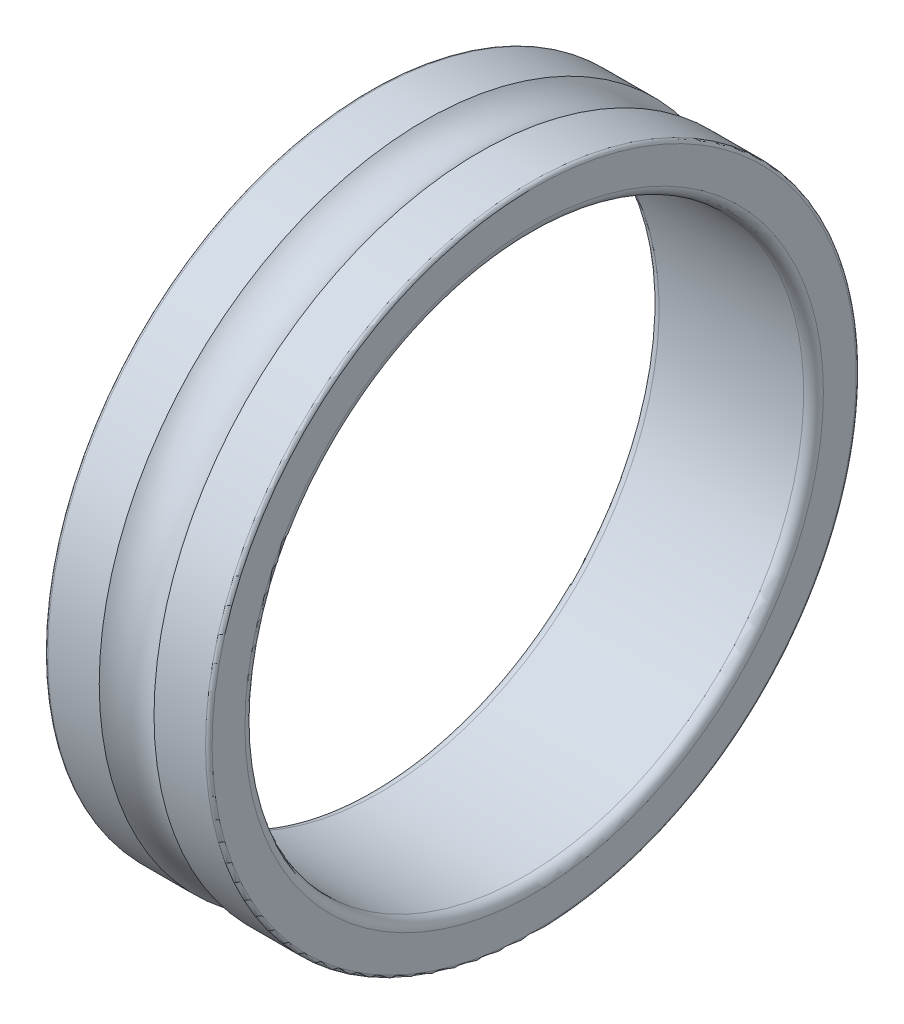
ISO-10303-21;
HEADER;
FILE_DESCRIPTION(('STEP AP214'),'2;1');
FILE_NAME('part.step','',(''),(''),'','','');
FILE_SCHEMA(('AUTOMOTIVE_DESIGN { 1 0 10303 214 1 1 1 1 }'));
ENDSEC;
DATA;
#1=APPLICATION_CONTEXT('core data for automotive mechanical design processes');
#2=APPLICATION_PROTOCOL_DEFINITION('international standard','automotive_design',2000,#1);
#3=PRODUCT_CONTEXT('',#1,'mechanical');
#4=PRODUCT('Part','Part','',(#3));
#5=PRODUCT_RELATED_PRODUCT_CATEGORY('part','',(#4));
#6=PRODUCT_DEFINITION_FORMATION('','',#4);
#7=PRODUCT_DEFINITION_CONTEXT('part definition',#1,'design');
#8=PRODUCT_DEFINITION('design','',#6,#7);
#9=PRODUCT_DEFINITION_SHAPE('','',#8);
#10=(LENGTH_UNIT() NAMED_UNIT(*) SI_UNIT(.MILLI.,.METRE.));
#11=(NAMED_UNIT(*) PLANE_ANGLE_UNIT() SI_UNIT($,.RADIAN.));
#12=(NAMED_UNIT(*) SI_UNIT($,.STERADIAN.) SOLID_ANGLE_UNIT());
#13=UNCERTAINTY_MEASURE_WITH_UNIT(LENGTH_MEASURE(1.E-05),#10,'distance_accuracy_value','');
#14=(GEOMETRIC_REPRESENTATION_CONTEXT(3) GLOBAL_UNCERTAINTY_ASSIGNED_CONTEXT((#13)) GLOBAL_UNIT_ASSIGNED_CONTEXT((#10,
#11,#12)) REPRESENTATION_CONTEXT('',''));
#15=CARTESIAN_POINT('',(0.,0.,0.));
#16=DIRECTION('',(0.,0.,1.));
#17=DIRECTION('',(1.,0.,0.));
#18=AXIS2_PLACEMENT_3D('',#15,#16,#17);
#19=CARTESIAN_POINT('',(0.,-10.0677747850563,-9.8));
#20=DIRECTION('',(-1.,0.,0.));
#21=DIRECTION('',(0.,0.,1.));
#22=AXIS2_PLACEMENT_3D('',#19,#20,#21);
#23=PLANE('',#22);
#24=CARTESIAN_POINT('',(0.,0.,0.));
#25=DIRECTION('',(-1.,0.,0.));
#26=DIRECTION('',(0.,0.,-1.));
#27=AXIS2_PLACEMENT_3D('',#24,#25,#26);
#28=CIRCLE('',#27,9.8);
#29=CARTESIAN_POINT('',(0.,0.,-9.8));
#30=VERTEX_POINT('',#29);
#31=EDGE_CURVE('E50',#30,#30,#28,.F.);
#32=ORIENTED_EDGE('',*,*,#31,.F.);
#33=EDGE_LOOP('',(#32));
#34=FACE_BOUND('',#33,.T.);
#35=CARTESIAN_POINT('',(0.,0.,0.));
#36=DIRECTION('',(1.,0.,0.));
#37=DIRECTION('',(0.,0.,1.));
#38=AXIS2_PLACEMENT_3D('',#35,#36,#37);
#39=CIRCLE('',#38,8.80000001843172);
#40=CARTESIAN_POINT('',(0.,0.,8.80000001843172));
#41=VERTEX_POINT('',#40);
#42=EDGE_CURVE('E47',#41,#41,#39,.T.);
#43=ORIENTED_EDGE('',*,*,#42,.T.);
#44=EDGE_LOOP('',(#43));
#45=FACE_BOUND('',#44,.T.);
#46=ADVANCED_FACE('F15',(#34,#45),#23,.T.);
#47=CARTESIAN_POINT('',(5.,-10.0677747850563,9.8));
#48=DIRECTION('',(1.,0.,0.));
#49=DIRECTION('',(0.,0.,-1.));
#50=AXIS2_PLACEMENT_3D('',#47,#48,#49);
#51=PLANE('',#50);
#52=CARTESIAN_POINT('',(5.,0.,0.));
#53=DIRECTION('',(1.,0.,0.));
#54=DIRECTION('',(0.,0.,1.));
#55=AXIS2_PLACEMENT_3D('',#52,#53,#54);
#56=CIRCLE('',#55,9.8);
#57=CARTESIAN_POINT('',(5.,0.,9.8));
#58=VERTEX_POINT('',#57);
#59=EDGE_CURVE('E44',#58,#58,#56,.T.);
#60=ORIENTED_EDGE('',*,*,#59,.T.);
#61=EDGE_LOOP('',(#60));
#62=FACE_BOUND('',#61,.T.);
#63=CARTESIAN_POINT('',(5.,0.,0.));
#64=DIRECTION('',(-1.,0.,0.));
#65=DIRECTION('',(0.,0.,-1.));
#66=AXIS2_PLACEMENT_3D('',#63,#64,#65);
#67=CIRCLE('',#66,8.80000005419997);
#68=CARTESIAN_POINT('',(5.,0.,-8.80000005419997));
#69=VERTEX_POINT('',#68);
#70=EDGE_CURVE('E41',#69,#69,#67,.F.);
#71=ORIENTED_EDGE('',*,*,#70,.F.);
#72=EDGE_LOOP('',(#71));
#73=FACE_BOUND('',#72,.T.);
#74=ADVANCED_FACE('F58',(#62,#73),#51,.T.);
#75=CARTESIAN_POINT('',(0.299999999999936,0.,0.));
#76=DIRECTION('',(1.,0.,0.));
#77=DIRECTION('',(0.,0.,1.));
#78=AXIS2_PLACEMENT_3D('',#75,#76,#77);
#79=TOROIDAL_SURFACE('',#78,8.8,0.299999999999936);
#80=CARTESIAN_POINT('',(0.299999999999995,0.,0.));
#81=DIRECTION('',(1.,0.,0.));
#82=DIRECTION('',(0.,0.,1.));
#83=AXIS2_PLACEMENT_3D('',#80,#81,#82);
#84=CIRCLE('',#83,8.50000000000006);
#85=CARTESIAN_POINT('',(0.299999999999995,0.,8.50000000000006));
#86=VERTEX_POINT('',#85);
#87=EDGE_CURVE('E38',#86,#86,#84,.T.);
#88=ORIENTED_EDGE('',*,*,#87,.T.);
#89=EDGE_LOOP('',(#88));
#90=FACE_BOUND('',#89,.T.);
#91=ORIENTED_EDGE('',*,*,#42,.F.);
#92=EDGE_LOOP('',(#91));
#93=FACE_BOUND('',#92,.T.);
#94=ADVANCED_FACE('F62',(#90,#93),#79,.T.);
#95=CARTESIAN_POINT('',(100.,0.,0.));
#96=DIRECTION('',(1.,0.,0.));
#97=DIRECTION('',(0.,0.,1.));
#98=AXIS2_PLACEMENT_3D('',#95,#96,#97);
#99=CYLINDRICAL_SURFACE('',#98,8.5);
#100=CARTESIAN_POINT('',(4.7,0.,0.));
#101=DIRECTION('',(1.,0.,0.));
#102=DIRECTION('',(0.,0.,1.));
#103=AXIS2_PLACEMENT_3D('',#100,#101,#102);
#104=CIRCLE('',#103,8.5);
#105=CARTESIAN_POINT('',(4.7,0.,8.5));
#106=VERTEX_POINT('',#105);
#107=EDGE_CURVE('E35',#106,#106,#104,.T.);
#108=ORIENTED_EDGE('',*,*,#107,.T.);
#109=EDGE_LOOP('',(#108));
#110=FACE_BOUND('',#109,.T.);
#111=ORIENTED_EDGE('',*,*,#87,.F.);
#112=EDGE_LOOP('',(#111));
#113=FACE_BOUND('',#112,.T.);
#114=ADVANCED_FACE('F64',(#110,#113),#99,.F.);
#115=CARTESIAN_POINT('',(4.70000000000013,0.,0.));
#116=DIRECTION('',(1.,0.,0.));
#117=DIRECTION('',(0.,0.,1.));
#118=AXIS2_PLACEMENT_3D('',#115,#116,#117);
#119=TOROIDAL_SURFACE('',#118,8.79999999999988,0.299999999999875);
#120=ORIENTED_EDGE('',*,*,#70,.T.);
#121=EDGE_LOOP('',(#120));
#122=FACE_BOUND('',#121,.T.);
#123=ORIENTED_EDGE('',*,*,#107,.F.);
#124=EDGE_LOOP('',(#123));
#125=FACE_BOUND('',#124,.T.);
#126=ADVANCED_FACE('F72',(#122,#125),#119,.T.);
#127=CARTESIAN_POINT('',(4.90000000000015,0.,0.));
#128=DIRECTION('',(1.,0.,0.));
#129=DIRECTION('',(0.,0.,1.));
#130=AXIS2_PLACEMENT_3D('',#127,#128,#129);
#131=TOROIDAL_SURFACE('',#130,9.80000000000015,0.0999999999998467);
#132=CARTESIAN_POINT('',(4.90000000000015,0.,0.));
#133=DIRECTION('',(1.,0.,0.));
#134=DIRECTION('',(0.,0.,1.));
#135=AXIS2_PLACEMENT_3D('',#132,#133,#134);
#136=CIRCLE('',#135,9.9);
#137=CARTESIAN_POINT('',(4.90000000000015,0.,9.9));
#138=VERTEX_POINT('',#137);
#139=EDGE_CURVE('E30',#138,#138,#136,.T.);
#140=ORIENTED_EDGE('',*,*,#139,.T.);
#141=EDGE_LOOP('',(#140));
#142=FACE_BOUND('',#141,.T.);
#143=ORIENTED_EDGE('',*,*,#59,.F.);
#144=EDGE_LOOP('',(#143));
#145=FACE_BOUND('',#144,.T.);
#146=ADVANCED_FACE('F80',(#142,#145),#131,.T.);
#147=CARTESIAN_POINT('',(100.,0.,0.));
#148=DIRECTION('',(1.,0.,0.));
#149=DIRECTION('',(0.,0.,1.));
#150=AXIS2_PLACEMENT_3D('',#147,#148,#149);
#151=CYLINDRICAL_SURFACE('',#150,9.9);
#152=CARTESIAN_POINT('',(3.3335407908435,0.,0.));
#153=DIRECTION('',(1.,0.,0.));
#154=DIRECTION('',(0.,0.,1.));
#155=AXIS2_PLACEMENT_3D('',#152,#153,#154);
#156=CIRCLE('',#155,9.9);
#157=CARTESIAN_POINT('',(3.3335407908435,0.,9.9));
#158=VERTEX_POINT('',#157);
#159=EDGE_CURVE('E26',#158,#158,#156,.T.);
#160=ORIENTED_EDGE('',*,*,#159,.T.);
#161=EDGE_LOOP('',(#160));
#162=FACE_BOUND('',#161,.T.);
#163=ORIENTED_EDGE('',*,*,#139,.F.);
#164=EDGE_LOOP('',(#163));
#165=FACE_BOUND('',#164,.T.);
#166=ADVANCED_FACE('F84',(#162,#165),#151,.T.);
#167=CARTESIAN_POINT('',(2.5,0.,0.));
#168=DIRECTION('',(1.,0.,0.));
#169=DIRECTION('',(0.,0.,1.));
#170=AXIS2_PLACEMENT_3D('',#167,#168,#169);
#171=TOROIDAL_SURFACE('',#170,10.75,1.1905);
#172=ORIENTED_EDGE('',*,*,#159,.F.);
#173=EDGE_LOOP('',(#172));
#174=FACE_BOUND('',#173,.T.);
#175=CARTESIAN_POINT('',(1.6664592091565,0.,0.));
#176=DIRECTION('',(1.,0.,0.));
#177=DIRECTION('',(0.,0.,1.));
#178=AXIS2_PLACEMENT_3D('',#175,#176,#177);
#179=CIRCLE('',#178,9.9);
#180=CARTESIAN_POINT('',(1.6664592091565,0.,9.9));
#181=VERTEX_POINT('',#180);
#182=EDGE_CURVE('E22',#181,#181,#179,.T.);
#183=ORIENTED_EDGE('',*,*,#182,.T.);
#184=EDGE_LOOP('',(#183));
#185=FACE_BOUND('',#184,.T.);
#186=ADVANCED_FACE('F88',(#174,#185),#171,.F.);
#187=CARTESIAN_POINT('',(100.,0.,0.));
#188=DIRECTION('',(1.,0.,0.));
#189=DIRECTION('',(0.,0.,1.));
#190=AXIS2_PLACEMENT_3D('',#187,#188,#189);
#191=CYLINDRICAL_SURFACE('',#190,9.9);
#192=CARTESIAN_POINT('',(0.100000000000009,0.,0.));
#193=DIRECTION('',(1.,0.,0.));
#194=DIRECTION('',(0.,0.,1.));
#195=AXIS2_PLACEMENT_3D('',#192,#193,#194);
#196=CIRCLE('',#195,9.9);
#197=CARTESIAN_POINT('',(0.100000000000009,0.,9.9));
#198=VERTEX_POINT('',#197);
#199=EDGE_CURVE('E10',#198,#198,#196,.T.);
#200=ORIENTED_EDGE('',*,*,#199,.T.);
#201=EDGE_LOOP('',(#200));
#202=FACE_BOUND('',#201,.T.);
#203=ORIENTED_EDGE('',*,*,#182,.F.);
#204=EDGE_LOOP('',(#203));
#205=FACE_BOUND('',#204,.T.);
#206=ADVANCED_FACE('F91',(#202,#205),#191,.T.);
#207=CARTESIAN_POINT('',(0.0999999999999242,0.,0.));
#208=DIRECTION('',(1.,0.,0.));
#209=DIRECTION('',(0.,0.,1.));
#210=AXIS2_PLACEMENT_3D('',#207,#208,#209);
#211=TOROIDAL_SURFACE('',#210,9.8,0.0999999999999231);
#212=ORIENTED_EDGE('',*,*,#31,.T.);
#213=EDGE_LOOP('',(#212));
#214=FACE_BOUND('',#213,.T.);
#215=ORIENTED_EDGE('',*,*,#199,.F.);
#216=EDGE_LOOP('',(#215));
#217=FACE_BOUND('',#216,.T.);
#218=ADVANCED_FACE('F17',(#214,#217),#211,.T.);
#219=CLOSED_SHELL('',(#46,#74,#94,#114,#126,#146,#166,#186,#206,#218));
#220=MANIFOLD_SOLID_BREP('B1',#219);
#221=ADVANCED_BREP_SHAPE_REPRESENTATION('',(#18,#220),#14);
#222=SHAPE_DEFINITION_REPRESENTATION(#9,#221);
ENDSEC;
END-ISO-10303-21;
